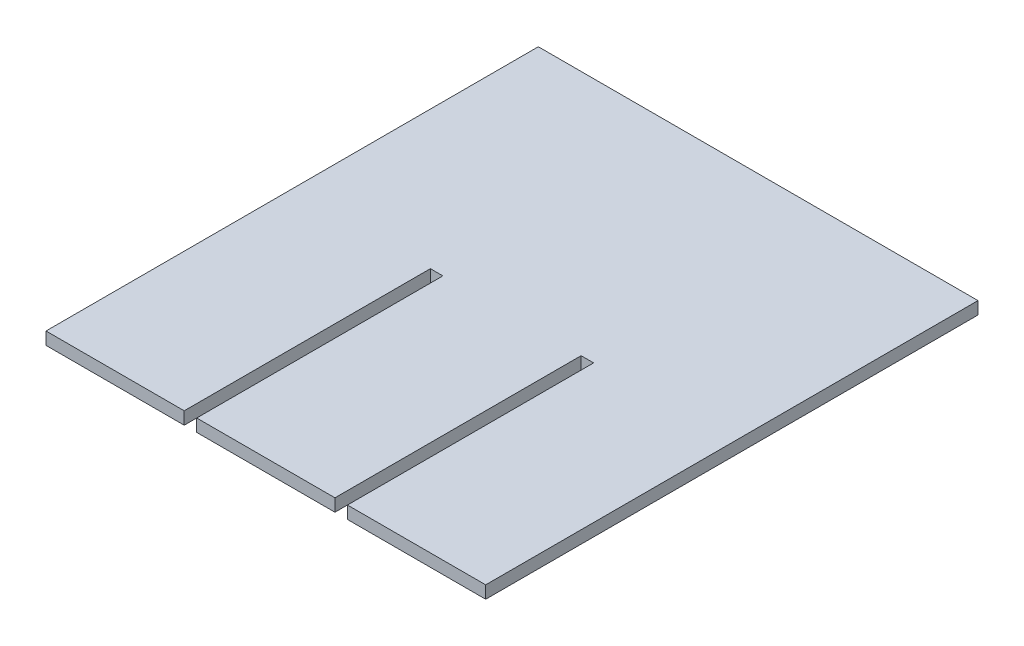
ISO-10303-21;
HEADER;
FILE_DESCRIPTION(('STEP AP214'),'2;1');
FILE_NAME('part.step','',(''),(''),'','','');
FILE_SCHEMA(('AUTOMOTIVE_DESIGN { 1 0 10303 214 1 1 1 1 }'));
ENDSEC;
DATA;
#1=APPLICATION_CONTEXT('core data for automotive mechanical design processes');
#2=APPLICATION_PROTOCOL_DEFINITION('international standard','automotive_design',2000,#1);
#3=PRODUCT_CONTEXT('',#1,'mechanical');
#4=PRODUCT('Part','Part','',(#3));
#5=PRODUCT_RELATED_PRODUCT_CATEGORY('part','',(#4));
#6=PRODUCT_DEFINITION_FORMATION('','',#4);
#7=PRODUCT_DEFINITION_CONTEXT('part definition',#1,'design');
#8=PRODUCT_DEFINITION('design','',#6,#7);
#9=PRODUCT_DEFINITION_SHAPE('','',#8);
#10=(LENGTH_UNIT() NAMED_UNIT(*) SI_UNIT(.MILLI.,.METRE.));
#11=(NAMED_UNIT(*) PLANE_ANGLE_UNIT() SI_UNIT($,.RADIAN.));
#12=(NAMED_UNIT(*) SI_UNIT($,.STERADIAN.) SOLID_ANGLE_UNIT());
#13=UNCERTAINTY_MEASURE_WITH_UNIT(LENGTH_MEASURE(1.E-05),#10,'distance_accuracy_value','');
#14=(GEOMETRIC_REPRESENTATION_CONTEXT(3) GLOBAL_UNCERTAINTY_ASSIGNED_CONTEXT((#13)) GLOBAL_UNIT_ASSIGNED_CONTEXT((#10,
#11,#12)) REPRESENTATION_CONTEXT('',''));
#15=CARTESIAN_POINT('',(0.,0.,0.));
#16=DIRECTION('',(0.,0.,1.));
#17=DIRECTION('',(1.,0.,0.));
#18=AXIS2_PLACEMENT_3D('',#15,#16,#17);
#19=CARTESIAN_POINT('',(0.,9.525,-187.5));
#20=DIRECTION('',(0.,0.,1.));
#21=DIRECTION('',(1.,0.,0.));
#22=AXIS2_PLACEMENT_3D('',#19,#20,#21);
#23=PLANE('',#22);
#24=DIRECTION('',(-1.,0.,0.));
#25=VECTOR('',#24,1.);
#26=CARTESIAN_POINT('',(0.,0.,-187.5));
#27=LINE('',#26,#25);
#28=CARTESIAN_POINT('',(229.616666666667,0.,-187.5));
#29=VERTEX_POINT('',#28);
#30=CARTESIAN_POINT('',(220.091666666667,0.,-187.5));
#31=VERTEX_POINT('',#30);
#32=EDGE_CURVE('E249',#29,#31,#27,.T.);
#33=ORIENTED_EDGE('',*,*,#32,.F.);
#34=DIRECTION('',(0.,-1.,0.));
#35=VECTOR('',#34,1.);
#36=CARTESIAN_POINT('',(229.616666666667,9.525,-187.5));
#37=LINE('',#36,#35);
#38=CARTESIAN_POINT('',(229.616666666667,9.525,-187.5));
#39=VERTEX_POINT('',#38);
#40=EDGE_CURVE('E11',#39,#29,#37,.T.);
#41=ORIENTED_EDGE('',*,*,#40,.F.);
#42=DIRECTION('',(-1.,0.,0.));
#43=VECTOR('',#42,1.);
#44=CARTESIAN_POINT('',(0.,9.525,-187.5));
#45=LINE('',#44,#43);
#46=CARTESIAN_POINT('',(220.091666666667,9.525,-187.5));
#47=VERTEX_POINT('',#46);
#48=EDGE_CURVE('E182',#39,#47,#45,.T.);
#49=ORIENTED_EDGE('',*,*,#48,.T.);
#50=DIRECTION('',(0.,-1.,0.));
#51=VECTOR('',#50,1.);
#52=CARTESIAN_POINT('',(220.091666666667,9.525,-187.5));
#53=LINE('',#52,#51);
#54=EDGE_CURVE('E109',#47,#31,#53,.T.);
#55=ORIENTED_EDGE('',*,*,#54,.T.);
#56=EDGE_LOOP('',(#33,#41,#49,#55));
#57=FACE_BOUND('',#56,.T.);
#58=ADVANCED_FACE('F45',(#57),#23,.T.);
#59=CARTESIAN_POINT('',(229.616666666667,9.525,-1.01970284068405E-13));
#60=DIRECTION('',(1.,0.,0.));
#61=DIRECTION('',(0.,0.,-1.));
#62=AXIS2_PLACEMENT_3D('',#59,#60,#61);
#63=PLANE('',#62);
#64=DIRECTION('',(0.,0.,1.));
#65=VECTOR('',#64,1.);
#66=CARTESIAN_POINT('',(229.616666666667,0.,-1.01970284068405E-13));
#67=LINE('',#66,#65);
#68=CARTESIAN_POINT('',(229.616666666667,0.,0.));
#69=VERTEX_POINT('',#68);
#70=EDGE_CURVE('E239',#29,#69,#67,.T.);
#71=ORIENTED_EDGE('',*,*,#70,.T.);
#72=DIRECTION('',(0.,-1.,0.));
#73=VECTOR('',#72,1.);
#74=CARTESIAN_POINT('',(229.616666666667,9.525,0.));
#75=LINE('',#74,#73);
#76=CARTESIAN_POINT('',(229.616666666667,9.525,0.));
#77=VERTEX_POINT('',#76);
#78=EDGE_CURVE('E54',#77,#69,#75,.T.);
#79=ORIENTED_EDGE('',*,*,#78,.F.);
#80=DIRECTION('',(0.,0.,1.));
#81=VECTOR('',#80,1.);
#82=CARTESIAN_POINT('',(229.616666666667,9.525,-1.01970284068405E-13));
#83=LINE('',#82,#81);
#84=EDGE_CURVE('E175',#39,#77,#83,.T.);
#85=ORIENTED_EDGE('',*,*,#84,.F.);
#86=ORIENTED_EDGE('',*,*,#40,.T.);
#87=EDGE_LOOP('',(#71,#79,#85,#86));
#88=FACE_BOUND('',#87,.T.);
#89=ADVANCED_FACE('F316',(#88),#63,.F.);
#90=CARTESIAN_POINT('',(0.,9.525,0.));
#91=DIRECTION('',(0.,0.,-1.));
#92=DIRECTION('',(-1.,0.,0.));
#93=AXIS2_PLACEMENT_3D('',#90,#91,#92);
#94=PLANE('',#93);
#95=DIRECTION('',(1.,0.,0.));
#96=VECTOR('',#95,1.);
#97=CARTESIAN_POINT('',(0.,0.,0.));
#98=LINE('',#97,#96);
#99=CARTESIAN_POINT('',(334.899999999999,0.,0.));
#100=VERTEX_POINT('',#99);
#101=EDGE_CURVE('E198',#69,#100,#98,.T.);
#102=ORIENTED_EDGE('',*,*,#101,.T.);
#103=DIRECTION('',(0.,-1.,0.));
#104=VECTOR('',#103,1.);
#105=CARTESIAN_POINT('',(334.899999999999,9.525,0.));
#106=LINE('',#105,#104);
#107=CARTESIAN_POINT('',(334.899999999999,9.525,0.));
#108=VERTEX_POINT('',#107);
#109=EDGE_CURVE('E225',#108,#100,#106,.T.);
#110=ORIENTED_EDGE('',*,*,#109,.F.);
#111=DIRECTION('',(1.,0.,0.));
#112=VECTOR('',#111,1.);
#113=CARTESIAN_POINT('',(0.,9.525,0.));
#114=LINE('',#113,#112);
#115=EDGE_CURVE('E164',#77,#108,#114,.T.);
#116=ORIENTED_EDGE('',*,*,#115,.F.);
#117=ORIENTED_EDGE('',*,*,#78,.T.);
#118=EDGE_LOOP('',(#102,#110,#116,#117));
#119=FACE_BOUND('',#118,.T.);
#120=ADVANCED_FACE('F233',(#119),#94,.F.);
#121=CARTESIAN_POINT('',(334.899999999999,9.525,5.45326746722217E-13));
#122=DIRECTION('',(-1.,0.,0.));
#123=DIRECTION('',(0.,0.,1.));
#124=AXIS2_PLACEMENT_3D('',#121,#122,#123);
#125=PLANE('',#124);
#126=DIRECTION('',(0.,0.,-1.));
#127=VECTOR('',#126,1.);
#128=CARTESIAN_POINT('',(334.899999999999,0.,5.45326746722217E-13));
#129=LINE('',#128,#127);
#130=CARTESIAN_POINT('',(334.9,0.,-374.999999999998));
#131=VERTEX_POINT('',#130);
#132=EDGE_CURVE('E242',#100,#131,#129,.T.);
#133=ORIENTED_EDGE('',*,*,#132,.T.);
#134=DIRECTION('',(0.,-1.,0.));
#135=VECTOR('',#134,1.);
#136=CARTESIAN_POINT('',(334.9,9.525,-374.999999999998));
#137=LINE('',#136,#135);
#138=CARTESIAN_POINT('',(334.9,9.525,-374.999999999998));
#139=VERTEX_POINT('',#138);
#140=EDGE_CURVE('E222',#139,#131,#137,.T.);
#141=ORIENTED_EDGE('',*,*,#140,.F.);
#142=DIRECTION('',(0.,0.,-1.));
#143=VECTOR('',#142,1.);
#144=CARTESIAN_POINT('',(334.899999999999,9.525,5.45326746722217E-13));
#145=LINE('',#144,#143);
#146=EDGE_CURVE('E174',#108,#139,#145,.T.);
#147=ORIENTED_EDGE('',*,*,#146,.F.);
#148=ORIENTED_EDGE('',*,*,#109,.T.);
#149=EDGE_LOOP('',(#133,#141,#147,#148));
#150=FACE_BOUND('',#149,.T.);
#151=ADVANCED_FACE('F323',(#150),#125,.F.);
#152=CARTESIAN_POINT('',(1.98905289571542E-12,9.525,-375.));
#153=DIRECTION('',(0.,0.,-1.));
#154=DIRECTION('',(-1.,0.,0.));
#155=AXIS2_PLACEMENT_3D('',#152,#153,#154);
#156=PLANE('',#155);
#157=DIRECTION('',(1.,0.,0.));
#158=VECTOR('',#157,1.);
#159=CARTESIAN_POINT('',(1.98905289571542E-12,0.,-375.));
#160=LINE('',#159,#158);
#161=CARTESIAN_POINT('',(0.,0.,-375.));
#162=VERTEX_POINT('',#161);
#163=EDGE_CURVE('E247',#162,#131,#160,.T.);
#164=ORIENTED_EDGE('',*,*,#163,.F.);
#165=DIRECTION('',(0.,-1.,0.));
#166=VECTOR('',#165,1.);
#167=CARTESIAN_POINT('',(0.,9.525,-375.));
#168=LINE('',#167,#166);
#169=CARTESIAN_POINT('',(0.,9.525,-375.));
#170=VERTEX_POINT('',#169);
#171=EDGE_CURVE('E219',#170,#162,#168,.T.);
#172=ORIENTED_EDGE('',*,*,#171,.F.);
#173=DIRECTION('',(1.,0.,0.));
#174=VECTOR('',#173,1.);
#175=CARTESIAN_POINT('',(1.98905289571542E-12,9.525,-375.));
#176=LINE('',#175,#174);
#177=EDGE_CURVE('E181',#170,#139,#176,.T.);
#178=ORIENTED_EDGE('',*,*,#177,.T.);
#179=ORIENTED_EDGE('',*,*,#140,.T.);
#180=EDGE_LOOP('',(#164,#172,#178,#179));
#181=FACE_BOUND('',#180,.T.);
#182=ADVANCED_FACE('F295',(#181),#156,.T.);
#183=CARTESIAN_POINT('',(0.,9.525,0.));
#184=DIRECTION('',(-1.,0.,0.));
#185=DIRECTION('',(0.,0.,1.));
#186=AXIS2_PLACEMENT_3D('',#183,#184,#185);
#187=PLANE('',#186);
#188=DIRECTION('',(0.,0.,-1.));
#189=VECTOR('',#188,1.);
#190=CARTESIAN_POINT('',(0.,0.,0.));
#191=LINE('',#190,#189);
#192=CARTESIAN_POINT('',(0.,0.,0.));
#193=VERTEX_POINT('',#192);
#194=EDGE_CURVE('E253',#193,#162,#191,.T.);
#195=ORIENTED_EDGE('',*,*,#194,.F.);
#196=DIRECTION('',(0.,-1.,0.));
#197=VECTOR('',#196,1.);
#198=CARTESIAN_POINT('',(0.,9.525,0.));
#199=LINE('',#198,#197);
#200=CARTESIAN_POINT('',(0.,9.525,0.));
#201=VERTEX_POINT('',#200);
#202=EDGE_CURVE('E216',#201,#193,#199,.T.);
#203=ORIENTED_EDGE('',*,*,#202,.F.);
#204=DIRECTION('',(0.,0.,-1.));
#205=VECTOR('',#204,1.);
#206=CARTESIAN_POINT('',(0.,9.525,0.));
#207=LINE('',#206,#205);
#208=EDGE_CURVE('E172',#201,#170,#207,.T.);
#209=ORIENTED_EDGE('',*,*,#208,.T.);
#210=ORIENTED_EDGE('',*,*,#171,.T.);
#211=EDGE_LOOP('',(#195,#203,#209,#210));
#212=FACE_BOUND('',#211,.T.);
#213=ADVANCED_FACE('F300',(#212),#187,.T.);
#214=CARTESIAN_POINT('',(105.283333333333,0.,0.));
#215=VERTEX_POINT('',#214);
#216=EDGE_CURVE('E197',#193,#215,#98,.T.);
#217=ORIENTED_EDGE('',*,*,#216,.T.);
#218=DIRECTION('',(0.,-1.,0.));
#219=VECTOR('',#218,1.);
#220=CARTESIAN_POINT('',(105.283333333333,9.525,0.));
#221=LINE('',#220,#219);
#222=CARTESIAN_POINT('',(105.283333333333,9.525,0.));
#223=VERTEX_POINT('',#222);
#224=EDGE_CURVE('E212',#223,#215,#221,.T.);
#225=ORIENTED_EDGE('',*,*,#224,.F.);
#226=EDGE_CURVE('E163',#201,#223,#114,.T.);
#227=ORIENTED_EDGE('',*,*,#226,.F.);
#228=ORIENTED_EDGE('',*,*,#202,.T.);
#229=EDGE_LOOP('',(#217,#225,#227,#228));
#230=FACE_BOUND('',#229,.T.);
#231=ADVANCED_FACE('F302',(#230),#94,.F.);
#232=CARTESIAN_POINT('',(105.283333333333,9.525,0.));
#233=DIRECTION('',(-1.,0.,0.));
#234=DIRECTION('',(0.,0.,1.));
#235=AXIS2_PLACEMENT_3D('',#232,#233,#234);
#236=PLANE('',#235);
#237=DIRECTION('',(0.,0.,-1.));
#238=VECTOR('',#237,1.);
#239=CARTESIAN_POINT('',(105.283333333333,0.,0.));
#240=LINE('',#239,#238);
#241=CARTESIAN_POINT('',(105.283333333333,0.,-187.5));
#242=VERTEX_POINT('',#241);
#243=EDGE_CURVE('E252',#215,#242,#240,.T.);
#244=ORIENTED_EDGE('',*,*,#243,.T.);
#245=DIRECTION('',(0.,-1.,0.));
#246=VECTOR('',#245,1.);
#247=CARTESIAN_POINT('',(105.283333333333,9.525,-187.5));
#248=LINE('',#247,#246);
#249=CARTESIAN_POINT('',(105.283333333333,9.525,-187.5));
#250=VERTEX_POINT('',#249);
#251=EDGE_CURVE('E208',#250,#242,#248,.T.);
#252=ORIENTED_EDGE('',*,*,#251,.F.);
#253=DIRECTION('',(0.,0.,-1.));
#254=VECTOR('',#253,1.);
#255=CARTESIAN_POINT('',(105.283333333333,9.525,0.));
#256=LINE('',#255,#254);
#257=EDGE_CURVE('E171',#223,#250,#256,.T.);
#258=ORIENTED_EDGE('',*,*,#257,.F.);
#259=ORIENTED_EDGE('',*,*,#224,.T.);
#260=EDGE_LOOP('',(#244,#252,#258,#259));
#261=FACE_BOUND('',#260,.T.);
#262=ADVANCED_FACE('F305',(#261),#236,.F.);
#263=CARTESIAN_POINT('',(0.,9.525,-187.5));
#264=DIRECTION('',(0.,0.,-1.));
#265=DIRECTION('',(-1.,0.,0.));
#266=AXIS2_PLACEMENT_3D('',#263,#264,#265);
#267=PLANE('',#266);
#268=DIRECTION('',(1.,0.,0.));
#269=VECTOR('',#268,1.);
#270=CARTESIAN_POINT('',(0.,0.,-187.5));
#271=LINE('',#270,#269);
#272=CARTESIAN_POINT('',(114.808333333333,0.,-187.5));
#273=VERTEX_POINT('',#272);
#274=EDGE_CURVE('E260',#242,#273,#271,.T.);
#275=ORIENTED_EDGE('',*,*,#274,.T.);
#276=DIRECTION('',(0.,-1.,0.));
#277=VECTOR('',#276,1.);
#278=CARTESIAN_POINT('',(114.808333333333,9.525,-187.5));
#279=LINE('',#278,#277);
#280=CARTESIAN_POINT('',(114.808333333333,9.525,-187.5));
#281=VERTEX_POINT('',#280);
#282=EDGE_CURVE('E157',#281,#273,#279,.T.);
#283=ORIENTED_EDGE('',*,*,#282,.F.);
#284=DIRECTION('',(1.,0.,0.));
#285=VECTOR('',#284,1.);
#286=CARTESIAN_POINT('',(0.,9.525,-187.5));
#287=LINE('',#286,#285);
#288=EDGE_CURVE('E146',#250,#281,#287,.T.);
#289=ORIENTED_EDGE('',*,*,#288,.F.);
#290=ORIENTED_EDGE('',*,*,#251,.T.);
#291=EDGE_LOOP('',(#275,#283,#289,#290));
#292=FACE_BOUND('',#291,.T.);
#293=ADVANCED_FACE('F275',(#292),#267,.F.);
#294=CARTESIAN_POINT('',(114.808333333333,9.525,0.));
#295=DIRECTION('',(1.,0.,0.));
#296=DIRECTION('',(0.,0.,-1.));
#297=AXIS2_PLACEMENT_3D('',#294,#295,#296);
#298=PLANE('',#297);
#299=DIRECTION('',(0.,0.,1.));
#300=VECTOR('',#299,1.);
#301=CARTESIAN_POINT('',(114.808333333333,0.,0.));
#302=LINE('',#301,#300);
#303=CARTESIAN_POINT('',(114.808333333333,0.,0.));
#304=VERTEX_POINT('',#303);
#305=EDGE_CURVE('E155',#273,#304,#302,.T.);
#306=ORIENTED_EDGE('',*,*,#305,.T.);
#307=DIRECTION('',(0.,-1.,0.));
#308=VECTOR('',#307,1.);
#309=CARTESIAN_POINT('',(114.808333333333,9.525,0.));
#310=LINE('',#309,#308);
#311=CARTESIAN_POINT('',(114.808333333333,9.525,0.));
#312=VERTEX_POINT('',#311);
#313=EDGE_CURVE('E152',#312,#304,#310,.T.);
#314=ORIENTED_EDGE('',*,*,#313,.F.);
#315=DIRECTION('',(0.,0.,1.));
#316=VECTOR('',#315,1.);
#317=CARTESIAN_POINT('',(114.808333333333,9.525,0.));
#318=LINE('',#317,#316);
#319=EDGE_CURVE('E140',#281,#312,#318,.T.);
#320=ORIENTED_EDGE('',*,*,#319,.F.);
#321=ORIENTED_EDGE('',*,*,#282,.T.);
#322=EDGE_LOOP('',(#306,#314,#320,#321));
#323=FACE_BOUND('',#322,.T.);
#324=ADVANCED_FACE('F153',(#323),#298,.F.);
#325=CARTESIAN_POINT('',(220.091666666667,0.,0.));
#326=VERTEX_POINT('',#325);
#327=EDGE_CURVE('E102',#304,#326,#98,.T.);
#328=ORIENTED_EDGE('',*,*,#327,.T.);
#329=DIRECTION('',(0.,-1.,0.));
#330=VECTOR('',#329,1.);
#331=CARTESIAN_POINT('',(220.091666666667,9.525,0.));
#332=LINE('',#331,#330);
#333=CARTESIAN_POINT('',(220.091666666667,9.525,0.));
#334=VERTEX_POINT('',#333);
#335=EDGE_CURVE('E158',#334,#326,#332,.T.);
#336=ORIENTED_EDGE('',*,*,#335,.F.);
#337=EDGE_CURVE('E144',#312,#334,#114,.T.);
#338=ORIENTED_EDGE('',*,*,#337,.F.);
#339=ORIENTED_EDGE('',*,*,#313,.T.);
#340=EDGE_LOOP('',(#328,#336,#338,#339));
#341=FACE_BOUND('',#340,.T.);
#342=ADVANCED_FACE('F160',(#341),#94,.F.);
#343=CARTESIAN_POINT('',(220.091666666667,9.525,0.));
#344=DIRECTION('',(-1.,0.,0.));
#345=DIRECTION('',(0.,0.,1.));
#346=AXIS2_PLACEMENT_3D('',#343,#344,#345);
#347=PLANE('',#346);
#348=DIRECTION('',(0.,0.,-1.));
#349=VECTOR('',#348,1.);
#350=CARTESIAN_POINT('',(220.091666666667,0.,0.));
#351=LINE('',#350,#349);
#352=EDGE_CURVE('E186',#326,#31,#351,.T.);
#353=ORIENTED_EDGE('',*,*,#352,.T.);
#354=ORIENTED_EDGE('',*,*,#54,.F.);
#355=DIRECTION('',(0.,0.,-1.));
#356=VECTOR('',#355,1.);
#357=CARTESIAN_POINT('',(220.091666666667,9.525,0.));
#358=LINE('',#357,#356);
#359=EDGE_CURVE('E62',#334,#47,#358,.T.);
#360=ORIENTED_EDGE('',*,*,#359,.F.);
#361=ORIENTED_EDGE('',*,*,#335,.T.);
#362=EDGE_LOOP('',(#353,#354,#360,#361));
#363=FACE_BOUND('',#362,.T.);
#364=ADVANCED_FACE('F367',(#363),#347,.F.);
#365=CARTESIAN_POINT('',(0.,9.525,0.));
#366=DIRECTION('',(0.,1.,0.));
#367=DIRECTION('',(0.,0.,1.));
#368=AXIS2_PLACEMENT_3D('',#365,#366,#367);
#369=PLANE('',#368);
#370=ORIENTED_EDGE('',*,*,#48,.F.);
#371=ORIENTED_EDGE('',*,*,#84,.T.);
#372=ORIENTED_EDGE('',*,*,#115,.T.);
#373=ORIENTED_EDGE('',*,*,#146,.T.);
#374=ORIENTED_EDGE('',*,*,#177,.F.);
#375=ORIENTED_EDGE('',*,*,#208,.F.);
#376=ORIENTED_EDGE('',*,*,#226,.T.);
#377=ORIENTED_EDGE('',*,*,#257,.T.);
#378=ORIENTED_EDGE('',*,*,#288,.T.);
#379=ORIENTED_EDGE('',*,*,#319,.T.);
#380=ORIENTED_EDGE('',*,*,#337,.T.);
#381=ORIENTED_EDGE('',*,*,#359,.T.);
#382=EDGE_LOOP('',(#370,#371,#372,#373,#374,#375,#376,#377,#378,#379,#380,#381));
#383=FACE_BOUND('',#382,.T.);
#384=ADVANCED_FACE('F142',(#383),#369,.T.);
#385=CARTESIAN_POINT('',(0.,0.,0.));
#386=DIRECTION('',(0.,1.,0.));
#387=DIRECTION('',(0.,0.,1.));
#388=AXIS2_PLACEMENT_3D('',#385,#386,#387);
#389=PLANE('',#388);
#390=ORIENTED_EDGE('',*,*,#32,.T.);
#391=ORIENTED_EDGE('',*,*,#352,.F.);
#392=ORIENTED_EDGE('',*,*,#327,.F.);
#393=ORIENTED_EDGE('',*,*,#305,.F.);
#394=ORIENTED_EDGE('',*,*,#274,.F.);
#395=ORIENTED_EDGE('',*,*,#243,.F.);
#396=ORIENTED_EDGE('',*,*,#216,.F.);
#397=ORIENTED_EDGE('',*,*,#194,.T.);
#398=ORIENTED_EDGE('',*,*,#163,.T.);
#399=ORIENTED_EDGE('',*,*,#132,.F.);
#400=ORIENTED_EDGE('',*,*,#101,.F.);
#401=ORIENTED_EDGE('',*,*,#70,.F.);
#402=EDGE_LOOP('',(#390,#391,#392,#393,#394,#395,#396,#397,#398,#399,#400,#401));
#403=FACE_BOUND('',#402,.T.);
#404=ADVANCED_FACE('F238',(#403),#389,.F.);
#405=CLOSED_SHELL('',(#58,#89,#120,#151,#182,#213,#231,#262,#293,#324,#342,#364,#384,#404));
#406=MANIFOLD_SOLID_BREP('B2',#405);
#407=ADVANCED_BREP_SHAPE_REPRESENTATION('',(#18,#406),#14);
#408=SHAPE_DEFINITION_REPRESENTATION(#9,#407);
ENDSEC;
END-ISO-10303-21;
